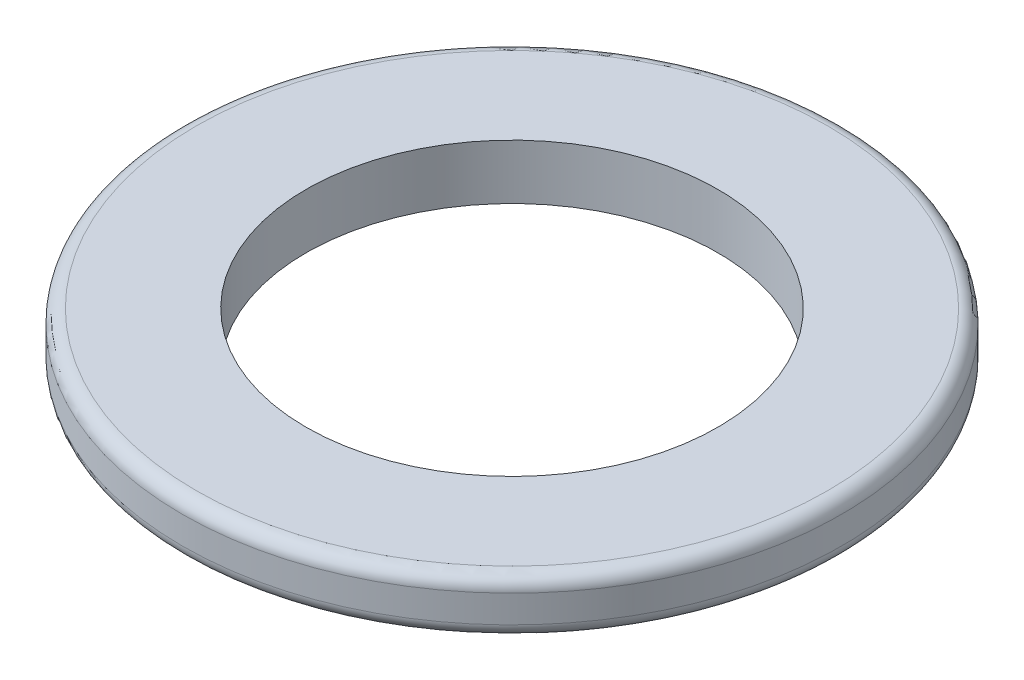
ISO-10303-21;
HEADER;
FILE_DESCRIPTION(('STEP AP214'),'2;1');
FILE_NAME('part.step','',(''),(''),'','','');
FILE_SCHEMA(('AUTOMOTIVE_DESIGN { 1 0 10303 214 1 1 1 1 }'));
ENDSEC;
DATA;
#1=APPLICATION_CONTEXT('core data for automotive mechanical design processes');
#2=APPLICATION_PROTOCOL_DEFINITION('international standard','automotive_design',2000,#1);
#3=PRODUCT_CONTEXT('',#1,'mechanical');
#4=PRODUCT('Part','Part','',(#3));
#5=PRODUCT_RELATED_PRODUCT_CATEGORY('part','',(#4));
#6=PRODUCT_DEFINITION_FORMATION('','',#4);
#7=PRODUCT_DEFINITION_CONTEXT('part definition',#1,'design');
#8=PRODUCT_DEFINITION('design','',#6,#7);
#9=PRODUCT_DEFINITION_SHAPE('','',#8);
#10=(LENGTH_UNIT() NAMED_UNIT(*) SI_UNIT(.MILLI.,.METRE.));
#11=(NAMED_UNIT(*) PLANE_ANGLE_UNIT() SI_UNIT($,.RADIAN.));
#12=(NAMED_UNIT(*) SI_UNIT($,.STERADIAN.) SOLID_ANGLE_UNIT());
#13=UNCERTAINTY_MEASURE_WITH_UNIT(LENGTH_MEASURE(1.E-05),#10,'distance_accuracy_value','');
#14=(GEOMETRIC_REPRESENTATION_CONTEXT(3) GLOBAL_UNCERTAINTY_ASSIGNED_CONTEXT((#13)) GLOBAL_UNIT_ASSIGNED_CONTEXT((#10,
#11,#12)) REPRESENTATION_CONTEXT('',''));
#15=CARTESIAN_POINT('',(0.,0.,0.));
#16=DIRECTION('',(0.,0.,1.));
#17=DIRECTION('',(1.,0.,0.));
#18=AXIS2_PLACEMENT_3D('',#15,#16,#17);
#19=CARTESIAN_POINT('',(0.,0.4,0.));
#20=DIRECTION('',(0.,1.,0.));
#21=DIRECTION('',(0.,0.,1.));
#22=AXIS2_PLACEMENT_3D('',#19,#20,#21);
#23=PLANE('',#22);
#24=CARTESIAN_POINT('',(0.,0.4,0.));
#25=DIRECTION('',(0.,1.,0.));
#26=DIRECTION('',(0.,0.,1.));
#27=AXIS2_PLACEMENT_3D('',#24,#25,#26);
#28=CIRCLE('',#27,2.3);
#29=CARTESIAN_POINT('',(0.,0.4,2.3));
#30=VERTEX_POINT('',#29);
#31=EDGE_CURVE('E47',#30,#30,#28,.T.);
#32=ORIENTED_EDGE('',*,*,#31,.T.);
#33=EDGE_LOOP('',(#32));
#34=FACE_BOUND('',#33,.T.);
#35=CARTESIAN_POINT('',(0.,0.4,0.));
#36=DIRECTION('',(0.,1.,0.));
#37=DIRECTION('',(0.,0.,1.));
#38=AXIS2_PLACEMENT_3D('',#35,#36,#37);
#39=CIRCLE('',#38,1.5);
#40=CARTESIAN_POINT('',(0.,0.4,1.5));
#41=VERTEX_POINT('',#40);
#42=EDGE_CURVE('E52',#41,#41,#39,.T.);
#43=ORIENTED_EDGE('',*,*,#42,.F.);
#44=EDGE_LOOP('',(#43));
#45=FACE_BOUND('',#44,.T.);
#46=ADVANCED_FACE('F32',(#34,#45),#23,.T.);
#47=CARTESIAN_POINT('',(0.,0.,0.));
#48=DIRECTION('',(0.,1.,0.));
#49=DIRECTION('',(0.,0.,1.));
#50=AXIS2_PLACEMENT_3D('',#47,#48,#49);
#51=PLANE('',#50);
#52=CARTESIAN_POINT('',(0.,0.,0.));
#53=DIRECTION('',(0.,1.,0.));
#54=DIRECTION('',(0.,0.,1.));
#55=AXIS2_PLACEMENT_3D('',#52,#53,#54);
#56=CIRCLE('',#55,2.3);
#57=CARTESIAN_POINT('',(0.,0.,2.3));
#58=VERTEX_POINT('',#57);
#59=EDGE_CURVE('E10',#58,#58,#56,.F.);
#60=ORIENTED_EDGE('',*,*,#59,.T.);
#61=EDGE_LOOP('',(#60));
#62=FACE_BOUND('',#61,.T.);
#63=CARTESIAN_POINT('',(0.,0.,0.));
#64=DIRECTION('',(0.,1.,0.));
#65=DIRECTION('',(0.,0.,1.));
#66=AXIS2_PLACEMENT_3D('',#63,#64,#65);
#67=CIRCLE('',#66,1.5);
#68=CARTESIAN_POINT('',(0.,0.,1.5));
#69=VERTEX_POINT('',#68);
#70=EDGE_CURVE('E53',#69,#69,#67,.T.);
#71=ORIENTED_EDGE('',*,*,#70,.T.);
#72=EDGE_LOOP('',(#71));
#73=FACE_BOUND('',#72,.T.);
#74=ADVANCED_FACE('F63',(#62,#73),#51,.F.);
#75=CARTESIAN_POINT('',(0.,0.4,0.));
#76=DIRECTION('',(0.,-1.,0.));
#77=DIRECTION('',(0.,0.,-1.));
#78=AXIS2_PLACEMENT_3D('',#75,#76,#77);
#79=CYLINDRICAL_SURFACE('',#78,2.4);
#80=CARTESIAN_POINT('',(0.,0.3,0.));
#81=DIRECTION('',(0.,1.,0.));
#82=DIRECTION('',(0.,0.,1.));
#83=AXIS2_PLACEMENT_3D('',#80,#81,#82);
#84=CIRCLE('',#83,2.4);
#85=CARTESIAN_POINT('',(0.,0.3,2.4));
#86=VERTEX_POINT('',#85);
#87=EDGE_CURVE('E39',#86,#86,#84,.F.);
#88=ORIENTED_EDGE('',*,*,#87,.T.);
#89=EDGE_LOOP('',(#88));
#90=FACE_BOUND('',#89,.T.);
#91=CARTESIAN_POINT('',(0.,0.1,0.));
#92=DIRECTION('',(0.,1.,0.));
#93=DIRECTION('',(0.,0.,1.));
#94=AXIS2_PLACEMENT_3D('',#91,#92,#93);
#95=CIRCLE('',#94,2.4);
#96=CARTESIAN_POINT('',(0.,0.1,2.4));
#97=VERTEX_POINT('',#96);
#98=EDGE_CURVE('E43',#97,#97,#95,.T.);
#99=ORIENTED_EDGE('',*,*,#98,.T.);
#100=EDGE_LOOP('',(#99));
#101=FACE_BOUND('',#100,.T.);
#102=ADVANCED_FACE('F69',(#90,#101),#79,.T.);
#103=CARTESIAN_POINT('',(0.,0.4,0.));
#104=DIRECTION('',(0.,-1.,0.));
#105=DIRECTION('',(0.,0.,-1.));
#106=AXIS2_PLACEMENT_3D('',#103,#104,#105);
#107=CYLINDRICAL_SURFACE('',#106,1.5);
#108=ORIENTED_EDGE('',*,*,#42,.T.);
#109=EDGE_LOOP('',(#108));
#110=FACE_BOUND('',#109,.T.);
#111=ORIENTED_EDGE('',*,*,#70,.F.);
#112=EDGE_LOOP('',(#111));
#113=FACE_BOUND('',#112,.T.);
#114=ADVANCED_FACE('F59',(#110,#113),#107,.F.);
#115=CARTESIAN_POINT('',(0.,0.3,0.));
#116=DIRECTION('',(0.,1.,0.));
#117=DIRECTION('',(0.,0.,1.));
#118=AXIS2_PLACEMENT_3D('',#115,#116,#117);
#119=TOROIDAL_SURFACE('',#118,2.3,0.1);
#120=ORIENTED_EDGE('',*,*,#87,.F.);
#121=EDGE_LOOP('',(#120));
#122=FACE_BOUND('',#121,.T.);
#123=ORIENTED_EDGE('',*,*,#31,.F.);
#124=EDGE_LOOP('',(#123));
#125=FACE_BOUND('',#124,.T.);
#126=ADVANCED_FACE('F74',(#122,#125),#119,.T.);
#127=CARTESIAN_POINT('',(0.,0.1,0.));
#128=DIRECTION('',(0.,1.,0.));
#129=DIRECTION('',(0.,0.,1.));
#130=AXIS2_PLACEMENT_3D('',#127,#128,#129);
#131=TOROIDAL_SURFACE('',#130,2.3,0.1);
#132=ORIENTED_EDGE('',*,*,#59,.F.);
#133=EDGE_LOOP('',(#132));
#134=FACE_BOUND('',#133,.T.);
#135=ORIENTED_EDGE('',*,*,#98,.F.);
#136=EDGE_LOOP('',(#135));
#137=FACE_BOUND('',#136,.T.);
#138=ADVANCED_FACE('F34',(#134,#137),#131,.T.);
#139=CLOSED_SHELL('',(#46,#74,#102,#114,#126,#138));
#140=MANIFOLD_SOLID_BREP('B2',#139);
#141=ADVANCED_BREP_SHAPE_REPRESENTATION('',(#18,#140),#14);
#142=SHAPE_DEFINITION_REPRESENTATION(#9,#141);
ENDSEC;
END-ISO-10303-21;
